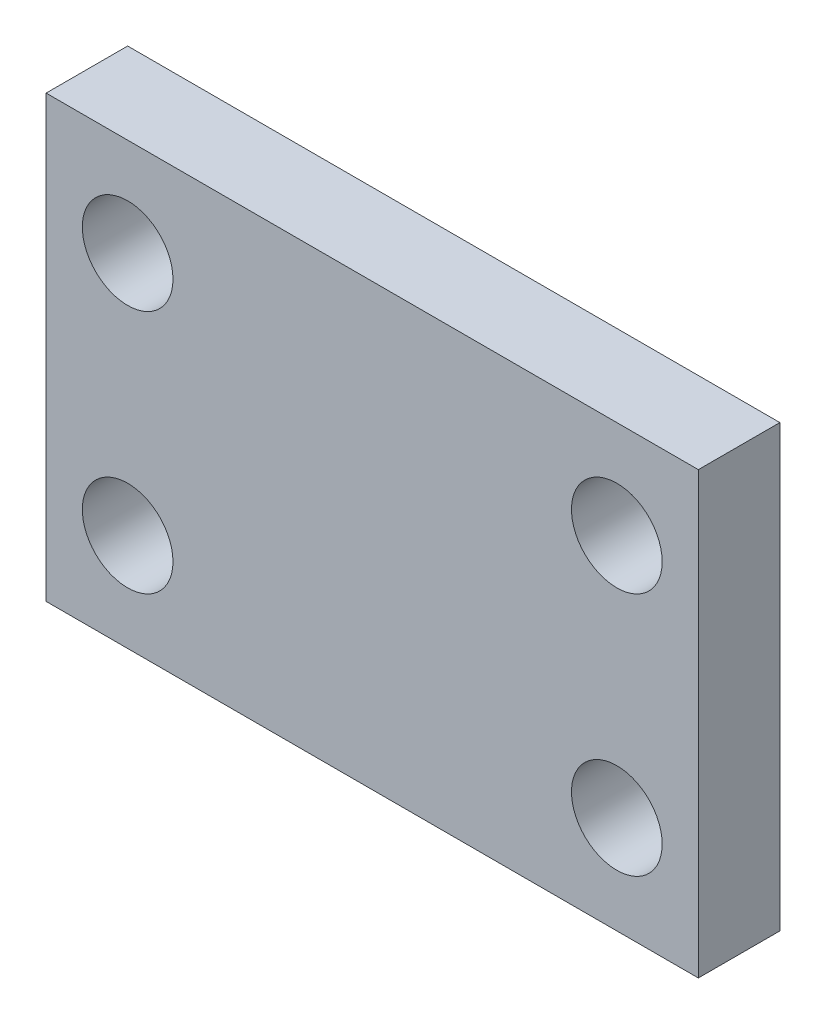
ISO-10303-21;
HEADER;
FILE_DESCRIPTION(('STEP AP214'),'2;1');
FILE_NAME('part.step','',(''),(''),'','','');
FILE_SCHEMA(('AUTOMOTIVE_DESIGN { 1 0 10303 214 1 1 1 1 }'));
ENDSEC;
DATA;
#1=APPLICATION_CONTEXT('core data for automotive mechanical design processes');
#2=APPLICATION_PROTOCOL_DEFINITION('international standard','automotive_design',2000,#1);
#3=PRODUCT_CONTEXT('',#1,'mechanical');
#4=PRODUCT('Part','Part','',(#3));
#5=PRODUCT_RELATED_PRODUCT_CATEGORY('part','',(#4));
#6=PRODUCT_DEFINITION_FORMATION('','',#4);
#7=PRODUCT_DEFINITION_CONTEXT('part definition',#1,'design');
#8=PRODUCT_DEFINITION('design','',#6,#7);
#9=PRODUCT_DEFINITION_SHAPE('','',#8);
#10=(LENGTH_UNIT() NAMED_UNIT(*) SI_UNIT(.MILLI.,.METRE.));
#11=(NAMED_UNIT(*) PLANE_ANGLE_UNIT() SI_UNIT($,.RADIAN.));
#12=(NAMED_UNIT(*) SI_UNIT($,.STERADIAN.) SOLID_ANGLE_UNIT());
#13=UNCERTAINTY_MEASURE_WITH_UNIT(LENGTH_MEASURE(1.E-05),#10,'distance_accuracy_value','');
#14=(GEOMETRIC_REPRESENTATION_CONTEXT(3) GLOBAL_UNCERTAINTY_ASSIGNED_CONTEXT((#13)) GLOBAL_UNIT_ASSIGNED_CONTEXT((#10,
#11,#12)) REPRESENTATION_CONTEXT('',''));
#15=CARTESIAN_POINT('',(0.,0.,0.));
#16=DIRECTION('',(0.,0.,1.));
#17=DIRECTION('',(1.,0.,0.));
#18=AXIS2_PLACEMENT_3D('',#15,#16,#17);
#19=CARTESIAN_POINT('',(-12.7,8.5725,3.175));
#20=DIRECTION('',(1.,0.,0.));
#21=DIRECTION('',(0.,1.,0.));
#22=AXIS2_PLACEMENT_3D('',#19,#20,#21);
#23=PLANE('',#22);
#24=DIRECTION('',(0.,-1.,0.));
#25=VECTOR('',#24,1.);
#26=CARTESIAN_POINT('',(-12.7,8.5725,0.));
#27=LINE('',#26,#25);
#28=CARTESIAN_POINT('',(-12.7,8.5725,0.));
#29=VERTEX_POINT('',#28);
#30=CARTESIAN_POINT('',(-12.7,-8.5725,0.));
#31=VERTEX_POINT('',#30);
#32=EDGE_CURVE('E416',#29,#31,#27,.T.);
#33=ORIENTED_EDGE('',*,*,#32,.T.);
#34=DIRECTION('',(0.,0.,-1.));
#35=VECTOR('',#34,1.);
#36=CARTESIAN_POINT('',(-12.7,-8.5725,3.175));
#37=LINE('',#36,#35);
#38=CARTESIAN_POINT('',(-12.7,-8.5725,3.175));
#39=VERTEX_POINT('',#38);
#40=EDGE_CURVE('E11',#39,#31,#37,.T.);
#41=ORIENTED_EDGE('',*,*,#40,.F.);
#42=DIRECTION('',(0.,-1.,0.));
#43=VECTOR('',#42,1.);
#44=CARTESIAN_POINT('',(-12.7,8.5725,3.175));
#45=LINE('',#44,#43);
#46=CARTESIAN_POINT('',(-12.7,8.5725,3.175));
#47=VERTEX_POINT('',#46);
#48=EDGE_CURVE('E439',#47,#39,#45,.T.);
#49=ORIENTED_EDGE('',*,*,#48,.F.);
#50=DIRECTION('',(0.,0.,-1.));
#51=VECTOR('',#50,1.);
#52=CARTESIAN_POINT('',(-12.7,8.5725,3.175));
#53=LINE('',#52,#51);
#54=EDGE_CURVE('E428',#47,#29,#53,.T.);
#55=ORIENTED_EDGE('',*,*,#54,.T.);
#56=EDGE_LOOP('',(#33,#41,#49,#55));
#57=FACE_BOUND('',#56,.T.);
#58=ADVANCED_FACE('F372',(#57),#23,.F.);
#59=CARTESIAN_POINT('',(-12.7,-8.5725,3.175));
#60=DIRECTION('',(0.,1.,0.));
#61=DIRECTION('',(0.,0.,1.));
#62=AXIS2_PLACEMENT_3D('',#59,#60,#61);
#63=PLANE('',#62);
#64=DIRECTION('',(1.,0.,0.));
#65=VECTOR('',#64,1.);
#66=CARTESIAN_POINT('',(-12.7,-8.5725,0.));
#67=LINE('',#66,#65);
#68=CARTESIAN_POINT('',(12.7,-8.5725,0.));
#69=VERTEX_POINT('',#68);
#70=EDGE_CURVE('E412',#31,#69,#67,.T.);
#71=ORIENTED_EDGE('',*,*,#70,.T.);
#72=DIRECTION('',(0.,0.,-1.));
#73=VECTOR('',#72,1.);
#74=CARTESIAN_POINT('',(12.7,-8.5725,3.175));
#75=LINE('',#74,#73);
#76=CARTESIAN_POINT('',(12.7,-8.5725,3.175));
#77=VERTEX_POINT('',#76);
#78=EDGE_CURVE('E379',#77,#69,#75,.T.);
#79=ORIENTED_EDGE('',*,*,#78,.F.);
#80=DIRECTION('',(1.,0.,0.));
#81=VECTOR('',#80,1.);
#82=CARTESIAN_POINT('',(-12.7,-8.5725,3.175));
#83=LINE('',#82,#81);
#84=EDGE_CURVE('E424',#39,#77,#83,.T.);
#85=ORIENTED_EDGE('',*,*,#84,.F.);
#86=ORIENTED_EDGE('',*,*,#40,.T.);
#87=EDGE_LOOP('',(#71,#79,#85,#86));
#88=FACE_BOUND('',#87,.T.);
#89=ADVANCED_FACE('F423',(#88),#63,.F.);
#90=CARTESIAN_POINT('',(12.7,8.5725,3.175));
#91=DIRECTION('',(-1.,0.,0.));
#92=DIRECTION('',(0.,-1.,0.));
#93=AXIS2_PLACEMENT_3D('',#90,#91,#92);
#94=PLANE('',#93);
#95=DIRECTION('',(0.,1.,0.));
#96=VECTOR('',#95,1.);
#97=CARTESIAN_POINT('',(12.7,8.5725,0.));
#98=LINE('',#97,#96);
#99=CARTESIAN_POINT('',(12.7,8.5725,0.));
#100=VERTEX_POINT('',#99);
#101=EDGE_CURVE('E417',#69,#100,#98,.T.);
#102=ORIENTED_EDGE('',*,*,#101,.T.);
#103=DIRECTION('',(0.,0.,-1.));
#104=VECTOR('',#103,1.);
#105=CARTESIAN_POINT('',(12.7,8.5725,3.175));
#106=LINE('',#105,#104);
#107=CARTESIAN_POINT('',(12.7,8.5725,3.175));
#108=VERTEX_POINT('',#107);
#109=EDGE_CURVE('E445',#108,#100,#106,.T.);
#110=ORIENTED_EDGE('',*,*,#109,.F.);
#111=DIRECTION('',(0.,1.,0.));
#112=VECTOR('',#111,1.);
#113=CARTESIAN_POINT('',(12.7,8.5725,3.175));
#114=LINE('',#113,#112);
#115=EDGE_CURVE('E391',#77,#108,#114,.T.);
#116=ORIENTED_EDGE('',*,*,#115,.F.);
#117=ORIENTED_EDGE('',*,*,#78,.T.);
#118=EDGE_LOOP('',(#102,#110,#116,#117));
#119=FACE_BOUND('',#118,.T.);
#120=ADVANCED_FACE('F448',(#119),#94,.F.);
#121=CARTESIAN_POINT('',(-12.7,8.5725,3.175));
#122=DIRECTION('',(0.,-1.,0.));
#123=DIRECTION('',(0.,0.,-1.));
#124=AXIS2_PLACEMENT_3D('',#121,#122,#123);
#125=PLANE('',#124);
#126=DIRECTION('',(-1.,0.,0.));
#127=VECTOR('',#126,1.);
#128=CARTESIAN_POINT('',(-12.7,8.5725,0.));
#129=LINE('',#128,#127);
#130=EDGE_CURVE('E437',#100,#29,#129,.T.);
#131=ORIENTED_EDGE('',*,*,#130,.T.);
#132=ORIENTED_EDGE('',*,*,#54,.F.);
#133=DIRECTION('',(-1.,0.,0.));
#134=VECTOR('',#133,1.);
#135=CARTESIAN_POINT('',(-12.7,8.5725,3.175));
#136=LINE('',#135,#134);
#137=EDGE_CURVE('E386',#108,#47,#136,.T.);
#138=ORIENTED_EDGE('',*,*,#137,.F.);
#139=ORIENTED_EDGE('',*,*,#109,.T.);
#140=EDGE_LOOP('',(#131,#132,#138,#139));
#141=FACE_BOUND('',#140,.T.);
#142=ADVANCED_FACE('F450',(#141),#125,.F.);
#143=CARTESIAN_POINT('',(-12.7,-8.5725,3.175));
#144=DIRECTION('',(0.,0.,1.));
#145=DIRECTION('',(1.,0.,0.));
#146=AXIS2_PLACEMENT_3D('',#143,#144,#145);
#147=PLANE('',#146);
#148=CARTESIAN_POINT('',(-9.525,-4.7625,3.175));
#149=DIRECTION('',(0.,0.,1.));
#150=DIRECTION('',(1.,0.,0.));
#151=AXIS2_PLACEMENT_3D('',#148,#149,#150);
#152=CIRCLE('',#151,1.7653);
#153=CARTESIAN_POINT('',(-7.7597,-4.7625,3.175));
#154=VERTEX_POINT('',#153);
#155=EDGE_CURVE('E523',#154,#154,#152,.T.);
#156=ORIENTED_EDGE('',*,*,#155,.F.);
#157=EDGE_LOOP('',(#156));
#158=FACE_BOUND('',#157,.T.);
#159=CARTESIAN_POINT('',(9.52499999999999,-4.76250000000002,3.175));
#160=DIRECTION('',(0.,0.,1.));
#161=DIRECTION('',(1.,0.,0.));
#162=AXIS2_PLACEMENT_3D('',#159,#160,#161);
#163=CIRCLE('',#162,1.7653);
#164=CARTESIAN_POINT('',(11.2903,-4.76250000000002,3.175));
#165=VERTEX_POINT('',#164);
#166=EDGE_CURVE('E525',#165,#165,#163,.T.);
#167=ORIENTED_EDGE('',*,*,#166,.F.);
#168=EDGE_LOOP('',(#167));
#169=FACE_BOUND('',#168,.T.);
#170=CARTESIAN_POINT('',(9.525,4.7625,3.175));
#171=DIRECTION('',(0.,0.,1.));
#172=DIRECTION('',(1.,0.,0.));
#173=AXIS2_PLACEMENT_3D('',#170,#171,#172);
#174=CIRCLE('',#173,1.7653);
#175=CARTESIAN_POINT('',(11.2903,4.7625,3.175));
#176=VERTEX_POINT('',#175);
#177=EDGE_CURVE('E533',#176,#176,#174,.T.);
#178=ORIENTED_EDGE('',*,*,#177,.F.);
#179=EDGE_LOOP('',(#178));
#180=FACE_BOUND('',#179,.T.);
#181=CARTESIAN_POINT('',(-9.525,4.7625,3.175));
#182=DIRECTION('',(0.,0.,1.));
#183=DIRECTION('',(1.,0.,0.));
#184=AXIS2_PLACEMENT_3D('',#181,#182,#183);
#185=CIRCLE('',#184,1.7653);
#186=CARTESIAN_POINT('',(-7.7597,4.7625,3.175));
#187=VERTEX_POINT('',#186);
#188=EDGE_CURVE('E432',#187,#187,#185,.T.);
#189=ORIENTED_EDGE('',*,*,#188,.F.);
#190=EDGE_LOOP('',(#189));
#191=FACE_BOUND('',#190,.T.);
#192=ORIENTED_EDGE('',*,*,#48,.T.);
#193=ORIENTED_EDGE('',*,*,#84,.T.);
#194=ORIENTED_EDGE('',*,*,#115,.T.);
#195=ORIENTED_EDGE('',*,*,#137,.T.);
#196=EDGE_LOOP('',(#192,#193,#194,#195));
#197=FACE_BOUND('',#196,.T.);
#198=ADVANCED_FACE('F451',(#158,#169,#180,#191,#197),#147,.T.);
#199=CARTESIAN_POINT('',(-12.7,-8.5725,0.));
#200=DIRECTION('',(0.,0.,1.));
#201=DIRECTION('',(1.,0.,0.));
#202=AXIS2_PLACEMENT_3D('',#199,#200,#201);
#203=PLANE('',#202);
#204=CARTESIAN_POINT('',(-9.525,-4.7625,0.));
#205=DIRECTION('',(0.,0.,1.));
#206=DIRECTION('',(1.,0.,0.));
#207=AXIS2_PLACEMENT_3D('',#204,#205,#206);
#208=CIRCLE('',#207,1.7653);
#209=CARTESIAN_POINT('',(-7.7597,-4.7625,0.));
#210=VERTEX_POINT('',#209);
#211=EDGE_CURVE('E521',#210,#210,#208,.T.);
#212=ORIENTED_EDGE('',*,*,#211,.T.);
#213=EDGE_LOOP('',(#212));
#214=FACE_BOUND('',#213,.T.);
#215=CARTESIAN_POINT('',(9.52499999999999,-4.76250000000002,0.));
#216=DIRECTION('',(0.,0.,1.));
#217=DIRECTION('',(1.,0.,0.));
#218=AXIS2_PLACEMENT_3D('',#215,#216,#217);
#219=CIRCLE('',#218,1.7653);
#220=CARTESIAN_POINT('',(11.2903,-4.76250000000002,0.));
#221=VERTEX_POINT('',#220);
#222=EDGE_CURVE('E530',#221,#221,#219,.T.);
#223=ORIENTED_EDGE('',*,*,#222,.T.);
#224=EDGE_LOOP('',(#223));
#225=FACE_BOUND('',#224,.T.);
#226=CARTESIAN_POINT('',(9.525,4.7625,0.));
#227=DIRECTION('',(0.,0.,1.));
#228=DIRECTION('',(1.,0.,0.));
#229=AXIS2_PLACEMENT_3D('',#226,#227,#228);
#230=CIRCLE('',#229,1.7653);
#231=CARTESIAN_POINT('',(11.2903,4.7625,0.));
#232=VERTEX_POINT('',#231);
#233=EDGE_CURVE('E536',#232,#232,#230,.T.);
#234=ORIENTED_EDGE('',*,*,#233,.T.);
#235=EDGE_LOOP('',(#234));
#236=FACE_BOUND('',#235,.T.);
#237=CARTESIAN_POINT('',(-9.525,4.7625,0.));
#238=DIRECTION('',(0.,0.,1.));
#239=DIRECTION('',(1.,0.,0.));
#240=AXIS2_PLACEMENT_3D('',#237,#238,#239);
#241=CIRCLE('',#240,1.7653);
#242=CARTESIAN_POINT('',(-7.7597,4.7625,0.));
#243=VERTEX_POINT('',#242);
#244=EDGE_CURVE('E429',#243,#243,#241,.T.);
#245=ORIENTED_EDGE('',*,*,#244,.T.);
#246=EDGE_LOOP('',(#245));
#247=FACE_BOUND('',#246,.T.);
#248=ORIENTED_EDGE('',*,*,#32,.F.);
#249=ORIENTED_EDGE('',*,*,#130,.F.);
#250=ORIENTED_EDGE('',*,*,#101,.F.);
#251=ORIENTED_EDGE('',*,*,#70,.F.);
#252=EDGE_LOOP('',(#248,#249,#250,#251));
#253=FACE_BOUND('',#252,.T.);
#254=ADVANCED_FACE('F413',(#214,#225,#236,#247,#253),#203,.F.);
#255=CARTESIAN_POINT('',(-9.525,4.7625,0.));
#256=DIRECTION('',(0.,0.,1.));
#257=DIRECTION('',(1.,0.,0.));
#258=AXIS2_PLACEMENT_3D('',#255,#256,#257);
#259=CYLINDRICAL_SURFACE('',#258,1.7653);
#260=ORIENTED_EDGE('',*,*,#244,.F.);
#261=EDGE_LOOP('',(#260));
#262=FACE_BOUND('',#261,.T.);
#263=ORIENTED_EDGE('',*,*,#188,.T.);
#264=EDGE_LOOP('',(#263));
#265=FACE_BOUND('',#264,.T.);
#266=ADVANCED_FACE('F459',(#262,#265),#259,.F.);
#267=CARTESIAN_POINT('',(9.525,4.7625,0.));
#268=DIRECTION('',(0.,0.,1.));
#269=DIRECTION('',(1.,0.,0.));
#270=AXIS2_PLACEMENT_3D('',#267,#268,#269);
#271=CYLINDRICAL_SURFACE('',#270,1.7653);
#272=ORIENTED_EDGE('',*,*,#233,.F.);
#273=EDGE_LOOP('',(#272));
#274=FACE_BOUND('',#273,.T.);
#275=ORIENTED_EDGE('',*,*,#177,.T.);
#276=EDGE_LOOP('',(#275));
#277=FACE_BOUND('',#276,.T.);
#278=ADVANCED_FACE('F492',(#274,#277),#271,.F.);
#279=CARTESIAN_POINT('',(9.52499999999999,-4.76250000000002,0.));
#280=DIRECTION('',(0.,0.,1.));
#281=DIRECTION('',(1.,0.,0.));
#282=AXIS2_PLACEMENT_3D('',#279,#280,#281);
#283=CYLINDRICAL_SURFACE('',#282,1.7653);
#284=ORIENTED_EDGE('',*,*,#222,.F.);
#285=EDGE_LOOP('',(#284));
#286=FACE_BOUND('',#285,.T.);
#287=ORIENTED_EDGE('',*,*,#166,.T.);
#288=EDGE_LOOP('',(#287));
#289=FACE_BOUND('',#288,.T.);
#290=ADVANCED_FACE('F500',(#286,#289),#283,.F.);
#291=CARTESIAN_POINT('',(-9.525,-4.7625,0.));
#292=DIRECTION('',(0.,0.,1.));
#293=DIRECTION('',(1.,0.,0.));
#294=AXIS2_PLACEMENT_3D('',#291,#292,#293);
#295=CYLINDRICAL_SURFACE('',#294,1.7653);
#296=ORIENTED_EDGE('',*,*,#211,.F.);
#297=EDGE_LOOP('',(#296));
#298=FACE_BOUND('',#297,.T.);
#299=ORIENTED_EDGE('',*,*,#155,.T.);
#300=EDGE_LOOP('',(#299));
#301=FACE_BOUND('',#300,.T.);
#302=ADVANCED_FACE('F508',(#298,#301),#295,.F.);
#303=CLOSED_SHELL('',(#58,#89,#120,#142,#198,#254,#266,#278,#290,#302));
#304=MANIFOLD_SOLID_BREP('B2',#303);
#305=ADVANCED_BREP_SHAPE_REPRESENTATION('',(#18,#304),#14);
#306=SHAPE_DEFINITION_REPRESENTATION(#9,#305);
ENDSEC;
END-ISO-10303-21;
